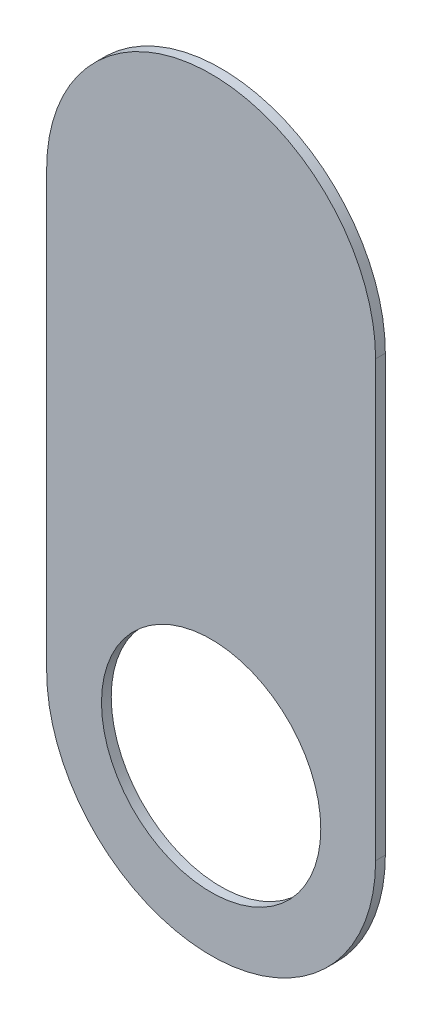
ISO-10303-21;
HEADER;
FILE_DESCRIPTION(('STEP AP214'),'2;1');
FILE_NAME('part.step','',(''),(''),'','','');
FILE_SCHEMA(('AUTOMOTIVE_DESIGN { 1 0 10303 214 1 1 1 1 }'));
ENDSEC;
DATA;
#1=APPLICATION_CONTEXT('core data for automotive mechanical design processes');
#2=APPLICATION_PROTOCOL_DEFINITION('international standard','automotive_design',2000,#1);
#3=PRODUCT_CONTEXT('',#1,'mechanical');
#4=PRODUCT('Part','Part','',(#3));
#5=PRODUCT_RELATED_PRODUCT_CATEGORY('part','',(#4));
#6=PRODUCT_DEFINITION_FORMATION('','',#4);
#7=PRODUCT_DEFINITION_CONTEXT('part definition',#1,'design');
#8=PRODUCT_DEFINITION('design','',#6,#7);
#9=PRODUCT_DEFINITION_SHAPE('','',#8);
#10=(LENGTH_UNIT() NAMED_UNIT(*) SI_UNIT(.MILLI.,.METRE.));
#11=(NAMED_UNIT(*) PLANE_ANGLE_UNIT() SI_UNIT($,.RADIAN.));
#12=(NAMED_UNIT(*) SI_UNIT($,.STERADIAN.) SOLID_ANGLE_UNIT());
#13=UNCERTAINTY_MEASURE_WITH_UNIT(LENGTH_MEASURE(1.E-05),#10,'distance_accuracy_value','');
#14=(GEOMETRIC_REPRESENTATION_CONTEXT(3) GLOBAL_UNCERTAINTY_ASSIGNED_CONTEXT((#13)) GLOBAL_UNIT_ASSIGNED_CONTEXT((#10,
#11,#12)) REPRESENTATION_CONTEXT('',''));
#15=CARTESIAN_POINT('',(0.,0.,0.));
#16=DIRECTION('',(0.,0.,1.));
#17=DIRECTION('',(1.,0.,0.));
#18=AXIS2_PLACEMENT_3D('',#15,#16,#17);
#19=CARTESIAN_POINT('',(55.4800008,75.3000272,0.));
#20=DIRECTION('',(-1.,0.,0.));
#21=DIRECTION('',(0.,1.,0.));
#22=AXIS2_PLACEMENT_3D('',#19,#20,#21);
#23=PLANE('',#22);
#24=DIRECTION('',(0.,1.,0.));
#25=VECTOR('',#24,1.);
#26=CARTESIAN_POINT('',(55.4800008,75.3000272,0.03556));
#27=LINE('',#26,#25);
#28=CARTESIAN_POINT('',(55.4800008,75.3000272,0.03556));
#29=VERTEX_POINT('',#28);
#30=CARTESIAN_POINT('',(55.4800008,76.8858,0.03556));
#31=VERTEX_POINT('',#30);
#32=EDGE_CURVE('E11',#29,#31,#27,.T.);
#33=ORIENTED_EDGE('',*,*,#32,.F.);
#34=DIRECTION('',(0.,0.,1.));
#35=VECTOR('',#34,1.);
#36=CARTESIAN_POINT('',(55.4800008,75.3000272,0.));
#37=LINE('',#36,#35);
#38=CARTESIAN_POINT('',(55.4800008,75.3000272,0.));
#39=VERTEX_POINT('',#38);
#40=EDGE_CURVE('E24',#39,#29,#37,.T.);
#41=ORIENTED_EDGE('',*,*,#40,.F.);
#42=DIRECTION('',(0.,1.,0.));
#43=VECTOR('',#42,1.);
#44=CARTESIAN_POINT('',(55.4800008,75.3000272,0.));
#45=LINE('',#44,#43);
#46=CARTESIAN_POINT('',(55.4800008,76.8858,0.));
#47=VERTEX_POINT('',#46);
#48=EDGE_CURVE('E96',#39,#47,#45,.T.);
#49=ORIENTED_EDGE('',*,*,#48,.T.);
#50=DIRECTION('',(0.,0.,1.));
#51=VECTOR('',#50,1.);
#52=CARTESIAN_POINT('',(55.4800008,76.8858,0.));
#53=LINE('',#52,#51);
#54=EDGE_CURVE('E37',#47,#31,#53,.T.);
#55=ORIENTED_EDGE('',*,*,#54,.T.);
#56=EDGE_LOOP('',(#33,#41,#49,#55));
#57=FACE_BOUND('',#56,.T.);
#58=ADVANCED_FACE('F17',(#57),#23,.F.);
#59=CARTESIAN_POINT('',(54.880002,75.3000272,0.));
#60=DIRECTION('',(0.,0.,-1.));
#61=DIRECTION('',(-1.,0.,0.));
#62=AXIS2_PLACEMENT_3D('',#59,#60,#61);
#63=CYLINDRICAL_SURFACE('',#62,0.599998800000004);
#64=CARTESIAN_POINT('',(54.880002,75.3000272,0.03556));
#65=DIRECTION('',(0.,0.,1.));
#66=DIRECTION('',(-1.,0.,0.));
#67=AXIS2_PLACEMENT_3D('',#64,#65,#66);
#68=CIRCLE('',#67,0.599998800000004);
#69=CARTESIAN_POINT('',(54.2800032,75.3000272,0.03556));
#70=VERTEX_POINT('',#69);
#71=EDGE_CURVE('E92',#70,#29,#68,.T.);
#72=ORIENTED_EDGE('',*,*,#71,.F.);
#73=DIRECTION('',(0.,0.,1.));
#74=VECTOR('',#73,1.);
#75=CARTESIAN_POINT('',(54.2800032,75.3000272,0.));
#76=LINE('',#75,#74);
#77=CARTESIAN_POINT('',(54.2800032,75.3000272,0.));
#78=VERTEX_POINT('',#77);
#79=EDGE_CURVE('E90',#78,#70,#76,.T.);
#80=ORIENTED_EDGE('',*,*,#79,.F.);
#81=CARTESIAN_POINT('',(54.880002,75.3000272,0.));
#82=DIRECTION('',(0.,0.,1.));
#83=DIRECTION('',(-1.,0.,0.));
#84=AXIS2_PLACEMENT_3D('',#81,#82,#83);
#85=CIRCLE('',#84,0.599998800000004);
#86=EDGE_CURVE('E88',#78,#39,#85,.T.);
#87=ORIENTED_EDGE('',*,*,#86,.T.);
#88=ORIENTED_EDGE('',*,*,#40,.T.);
#89=EDGE_LOOP('',(#72,#80,#87,#88));
#90=FACE_BOUND('',#89,.T.);
#91=ADVANCED_FACE('F111',(#90),#63,.T.);
#92=CARTESIAN_POINT('',(54.880002,76.8858,0.));
#93=DIRECTION('',(0.,0.,-1.));
#94=DIRECTION('',(1.,0.,0.));
#95=AXIS2_PLACEMENT_3D('',#92,#93,#94);
#96=CYLINDRICAL_SURFACE('',#95,0.599998799999999);
#97=CARTESIAN_POINT('',(54.880002,76.8858,0.03556));
#98=DIRECTION('',(0.,0.,1.));
#99=DIRECTION('',(1.,0.,0.));
#100=AXIS2_PLACEMENT_3D('',#97,#98,#99);
#101=CIRCLE('',#100,0.599998799999999);
#102=CARTESIAN_POINT('',(54.2800032,76.8858,0.03556));
#103=VERTEX_POINT('',#102);
#104=EDGE_CURVE('E85',#31,#103,#101,.T.);
#105=ORIENTED_EDGE('',*,*,#104,.F.);
#106=ORIENTED_EDGE('',*,*,#54,.F.);
#107=CARTESIAN_POINT('',(54.880002,76.8858,0.));
#108=DIRECTION('',(0.,0.,1.));
#109=DIRECTION('',(1.,0.,0.));
#110=AXIS2_PLACEMENT_3D('',#107,#108,#109);
#111=CIRCLE('',#110,0.599998799999999);
#112=CARTESIAN_POINT('',(54.2800032,76.8858,0.));
#113=VERTEX_POINT('',#112);
#114=EDGE_CURVE('E82',#47,#113,#111,.T.);
#115=ORIENTED_EDGE('',*,*,#114,.T.);
#116=DIRECTION('',(0.,0.,1.));
#117=VECTOR('',#116,1.);
#118=CARTESIAN_POINT('',(54.2800032,76.8858,0.));
#119=LINE('',#118,#117);
#120=EDGE_CURVE('E80',#113,#103,#119,.T.);
#121=ORIENTED_EDGE('',*,*,#120,.T.);
#122=EDGE_LOOP('',(#105,#106,#115,#121));
#123=FACE_BOUND('',#122,.T.);
#124=ADVANCED_FACE('F104',(#123),#96,.T.);
#125=CARTESIAN_POINT('',(54.2800032,76.8858,0.));
#126=DIRECTION('',(1.,0.,0.));
#127=DIRECTION('',(0.,-1.,0.));
#128=AXIS2_PLACEMENT_3D('',#125,#126,#127);
#129=PLANE('',#128);
#130=DIRECTION('',(0.,-1.,0.));
#131=VECTOR('',#130,1.);
#132=CARTESIAN_POINT('',(54.2800032,76.8858,0.03556));
#133=LINE('',#132,#131);
#134=EDGE_CURVE('E77',#103,#70,#133,.T.);
#135=ORIENTED_EDGE('',*,*,#134,.F.);
#136=ORIENTED_EDGE('',*,*,#120,.F.);
#137=DIRECTION('',(0.,-1.,0.));
#138=VECTOR('',#137,1.);
#139=CARTESIAN_POINT('',(54.2800032,76.8858,0.));
#140=LINE('',#139,#138);
#141=EDGE_CURVE('E68',#113,#78,#140,.T.);
#142=ORIENTED_EDGE('',*,*,#141,.T.);
#143=ORIENTED_EDGE('',*,*,#79,.T.);
#144=EDGE_LOOP('',(#135,#136,#142,#143));
#145=FACE_BOUND('',#144,.T.);
#146=ADVANCED_FACE('F110',(#145),#129,.F.);
#147=CARTESIAN_POINT('',(54.880002,75.3000272,0.));
#148=DIRECTION('',(0.,0.,-1.));
#149=DIRECTION('',(1.,0.,0.));
#150=AXIS2_PLACEMENT_3D('',#147,#148,#149);
#151=CYLINDRICAL_SURFACE('',#150,0.3999992);
#152=DIRECTION('',(0.,0.,1.));
#153=VECTOR('',#152,1.);
#154=CARTESIAN_POINT('',(55.2800012,75.3000272,0.));
#155=LINE('',#154,#153);
#156=CARTESIAN_POINT('',(55.2800012,75.3000272,0.));
#157=VERTEX_POINT('',#156);
#158=CARTESIAN_POINT('',(55.2800012,75.3000272,0.03556));
#159=VERTEX_POINT('',#158);
#160=EDGE_CURVE('E62',#157,#159,#155,.T.);
#161=ORIENTED_EDGE('',*,*,#160,.T.);
#162=CARTESIAN_POINT('',(54.880002,75.3000272,0.03556));
#163=DIRECTION('',(0.,0.,1.));
#164=DIRECTION('',(1.,0.,0.));
#165=AXIS2_PLACEMENT_3D('',#162,#163,#164);
#166=CIRCLE('',#165,0.3999992);
#167=EDGE_CURVE('E67',#159,#159,#166,.T.);
#168=ORIENTED_EDGE('',*,*,#167,.T.);
#169=ORIENTED_EDGE('',*,*,#160,.F.);
#170=CARTESIAN_POINT('',(54.880002,75.3000272,0.));
#171=DIRECTION('',(0.,0.,1.));
#172=DIRECTION('',(1.,0.,0.));
#173=AXIS2_PLACEMENT_3D('',#170,#171,#172);
#174=CIRCLE('',#173,0.3999992);
#175=EDGE_CURVE('E65',#157,#157,#174,.T.);
#176=ORIENTED_EDGE('',*,*,#175,.F.);
#177=EDGE_LOOP('',(#161,#168,#169,#176));
#178=FACE_BOUND('',#177,.T.);
#179=ADVANCED_FACE('F64',(#178),#151,.F.);
#180=CARTESIAN_POINT('',(55.4800008,75.3000272,0.));
#181=DIRECTION('',(0.,0.,-1.));
#182=DIRECTION('',(-1.,0.,0.));
#183=AXIS2_PLACEMENT_3D('',#180,#181,#182);
#184=PLANE('',#183);
#185=ORIENTED_EDGE('',*,*,#48,.F.);
#186=ORIENTED_EDGE('',*,*,#86,.F.);
#187=ORIENTED_EDGE('',*,*,#141,.F.);
#188=ORIENTED_EDGE('',*,*,#114,.F.);
#189=EDGE_LOOP('',(#185,#186,#187,#188));
#190=FACE_BOUND('',#189,.T.);
#191=ORIENTED_EDGE('',*,*,#175,.T.);
#192=EDGE_LOOP('',(#191));
#193=FACE_BOUND('',#192,.T.);
#194=ADVANCED_FACE('F71',(#190,#193),#184,.T.);
#195=CARTESIAN_POINT('',(55.4800008,75.3000272,0.03556));
#196=DIRECTION('',(0.,0.,-1.));
#197=DIRECTION('',(-1.,0.,0.));
#198=AXIS2_PLACEMENT_3D('',#195,#196,#197);
#199=PLANE('',#198);
#200=ORIENTED_EDGE('',*,*,#134,.T.);
#201=ORIENTED_EDGE('',*,*,#71,.T.);
#202=ORIENTED_EDGE('',*,*,#32,.T.);
#203=ORIENTED_EDGE('',*,*,#104,.T.);
#204=EDGE_LOOP('',(#200,#201,#202,#203));
#205=FACE_BOUND('',#204,.T.);
#206=ORIENTED_EDGE('',*,*,#167,.F.);
#207=EDGE_LOOP('',(#206));
#208=FACE_BOUND('',#207,.T.);
#209=ADVANCED_FACE('F107',(#205,#208),#199,.F.);
#210=CLOSED_SHELL('',(#58,#91,#124,#146,#179,#194,#209));
#211=MANIFOLD_SOLID_BREP('B1',#210);
#212=ADVANCED_BREP_SHAPE_REPRESENTATION('',(#18,#211),#14);
#213=SHAPE_DEFINITION_REPRESENTATION(#9,#212);
ENDSEC;
END-ISO-10303-21;
